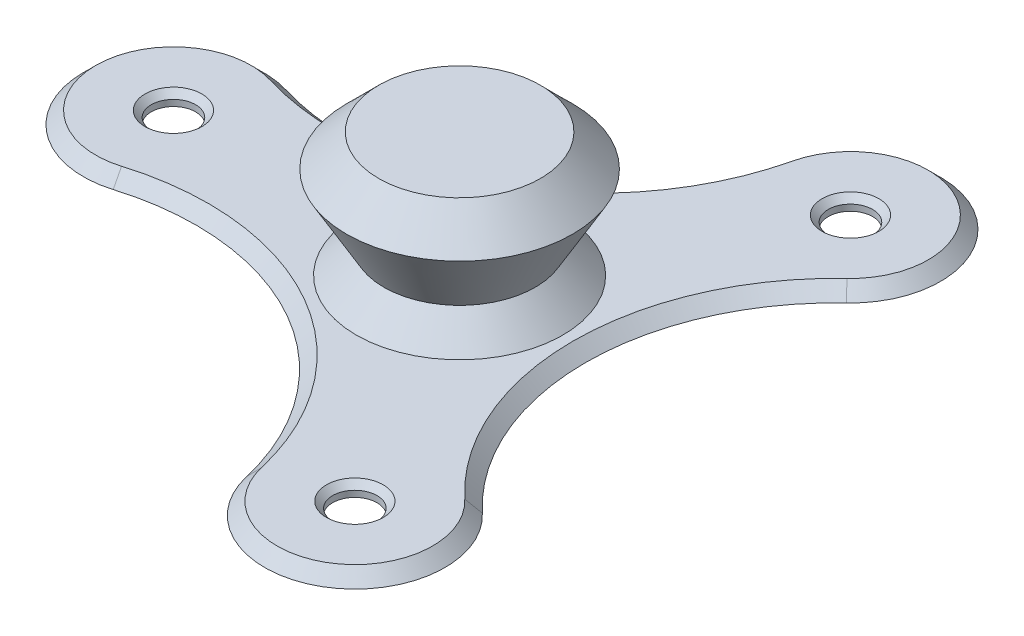
ISO-10303-21;
HEADER;
FILE_DESCRIPTION(('STEP AP214'),'2;1');
FILE_NAME('part.step','',(''),(''),'','','');
FILE_SCHEMA(('AUTOMOTIVE_DESIGN { 1 0 10303 214 1 1 1 1 }'));
ENDSEC;
DATA;
#1=APPLICATION_CONTEXT('core data for automotive mechanical design processes');
#2=APPLICATION_PROTOCOL_DEFINITION('international standard','automotive_design',2000,#1);
#3=PRODUCT_CONTEXT('',#1,'mechanical');
#4=PRODUCT('Part','Part','',(#3));
#5=PRODUCT_RELATED_PRODUCT_CATEGORY('part','',(#4));
#6=PRODUCT_DEFINITION_FORMATION('','',#4);
#7=PRODUCT_DEFINITION_CONTEXT('part definition',#1,'design');
#8=PRODUCT_DEFINITION('design','',#6,#7);
#9=PRODUCT_DEFINITION_SHAPE('','',#8);
#10=(LENGTH_UNIT() NAMED_UNIT(*) SI_UNIT(.MILLI.,.METRE.));
#11=(NAMED_UNIT(*) PLANE_ANGLE_UNIT() SI_UNIT($,.RADIAN.));
#12=(NAMED_UNIT(*) SI_UNIT($,.STERADIAN.) SOLID_ANGLE_UNIT());
#13=UNCERTAINTY_MEASURE_WITH_UNIT(LENGTH_MEASURE(1.E-05),#10,'distance_accuracy_value','');
#14=(GEOMETRIC_REPRESENTATION_CONTEXT(3) GLOBAL_UNCERTAINTY_ASSIGNED_CONTEXT((#13)) GLOBAL_UNIT_ASSIGNED_CONTEXT((#10,
#11,#12)) REPRESENTATION_CONTEXT('',''));
#15=CARTESIAN_POINT('',(0.,0.,0.));
#16=DIRECTION('',(0.,0.,1.));
#17=DIRECTION('',(1.,0.,0.));
#18=AXIS2_PLACEMENT_3D('',#15,#16,#17);
#19=CARTESIAN_POINT('',(-3.59374999999994,2.,-46.0617261637851));
#20=DIRECTION('',(0.,1.,0.));
#21=DIRECTION('',(0.,0.,1.));
#22=AXIS2_PLACEMENT_3D('',#19,#20,#21);
#23=PLANE('',#22);
#24=CARTESIAN_POINT('',(22.9999999999996,2.,39.8371685740844));
#25=DIRECTION('',(0.,1.,0.));
#26=DIRECTION('',(0.,0.,1.));
#27=AXIS2_PLACEMENT_3D('',#24,#25,#26);
#28=CIRCLE('',#27,4.56250000000001);
#29=CARTESIAN_POINT('',(22.9999999999996,2.,44.3996685740844));
#30=VERTEX_POINT('',#29);
#31=EDGE_CURVE('E180',#30,#30,#28,.F.);
#32=ORIENTED_EDGE('',*,*,#31,.T.);
#33=EDGE_LOOP('',(#32));
#34=FACE_BOUND('',#33,.T.);
#35=CARTESIAN_POINT('',(23.0000000000002,2.,-39.8371685740843));
#36=DIRECTION('',(0.,1.,0.));
#37=DIRECTION('',(0.,0.,1.));
#38=AXIS2_PLACEMENT_3D('',#35,#36,#37);
#39=CIRCLE('',#38,4.56250000000001);
#40=CARTESIAN_POINT('',(23.0000000000002,2.,-35.2746685740843));
#41=VERTEX_POINT('',#40);
#42=EDGE_CURVE('E177',#41,#41,#39,.F.);
#43=ORIENTED_EDGE('',*,*,#42,.T.);
#44=EDGE_LOOP('',(#43));
#45=FACE_BOUND('',#44,.T.);
#46=CARTESIAN_POINT('',(-46.,2.,0.));
#47=DIRECTION('',(0.,1.,0.));
#48=DIRECTION('',(0.,0.,1.));
#49=AXIS2_PLACEMENT_3D('',#46,#47,#48);
#50=CIRCLE('',#49,4.56250000000001);
#51=CARTESIAN_POINT('',(-46.,2.,4.56250000000001));
#52=VERTEX_POINT('',#51);
#53=EDGE_CURVE('E174',#52,#52,#50,.F.);
#54=ORIENTED_EDGE('',*,*,#53,.T.);
#55=EDGE_LOOP('',(#54));
#56=FACE_BOUND('',#55,.T.);
#57=CARTESIAN_POINT('',(22.9999999999996,2.,39.8371685740844));
#58=DIRECTION('',(0.,1.,0.));
#59=DIRECTION('',(0.,0.,1.));
#60=AXIS2_PLACEMENT_3D('',#57,#58,#59);
#61=CIRCLE('',#60,12.4999999999999);
#62=CARTESIAN_POINT('',(10.828947368421,2.,42.685936349691));
#63=VERTEX_POINT('',#62);
#64=CARTESIAN_POINT('',(31.5526315789471,2.,30.7211116921432));
#65=VERTEX_POINT('',#64);
#66=EDGE_CURVE('E67',#63,#65,#61,.T.);
#67=ORIENTED_EDGE('',*,*,#66,.T.);
#68=CARTESIAN_POINT('',(60.3750000000006,2.,3.03257842181724E-13));
#69=DIRECTION('',(0.,1.,0.));
#70=DIRECTION('',(0.,0.,1.));
#71=AXIS2_PLACEMENT_3D('',#68,#69,#70);
#72=CIRCLE('',#71,42.1250000000006);
#73=CARTESIAN_POINT('',(31.5526315789475,2.,-30.7211116921428));
#74=VERTEX_POINT('',#73);
#75=EDGE_CURVE('E161',#65,#74,#72,.F.);
#76=ORIENTED_EDGE('',*,*,#75,.T.);
#77=CARTESIAN_POINT('',(23.0000000000002,2.,-39.8371685740841));
#78=DIRECTION('',(0.,1.,0.));
#79=DIRECTION('',(0.,0.,1.));
#80=AXIS2_PLACEMENT_3D('',#77,#78,#79);
#81=CIRCLE('',#80,12.4999999999999);
#82=CARTESIAN_POINT('',(10.8289473684214,2.,-42.685936349691));
#83=VERTEX_POINT('',#82);
#84=EDGE_CURVE('E159',#74,#83,#81,.T.);
#85=ORIENTED_EDGE('',*,*,#84,.T.);
#86=CARTESIAN_POINT('',(-30.1875000000001,2.,-52.2862837534862));
#87=DIRECTION('',(0.,1.,0.));
#88=DIRECTION('',(0.,0.,1.));
#89=AXIS2_PLACEMENT_3D('',#86,#87,#88);
#90=CIRCLE('',#89,42.1250000000006);
#91=CARTESIAN_POINT('',(-42.3815789473686,2.,-11.9648246575481));
#92=VERTEX_POINT('',#91);
#93=EDGE_CURVE('E156',#83,#92,#90,.F.);
#94=ORIENTED_EDGE('',*,*,#93,.T.);
#95=CARTESIAN_POINT('',(-46.,2.,0.));
#96=DIRECTION('',(0.,1.,0.));
#97=DIRECTION('',(0.,0.,1.));
#98=AXIS2_PLACEMENT_3D('',#95,#96,#97);
#99=CIRCLE('',#98,12.4999999999999);
#100=CARTESIAN_POINT('',(-42.3815789473686,2.,11.9648246575481));
#101=VERTEX_POINT('',#100);
#102=EDGE_CURVE('E116',#92,#101,#99,.T.);
#103=ORIENTED_EDGE('',*,*,#102,.T.);
#104=CARTESIAN_POINT('',(-30.1875000000006,2.,52.2862837534859));
#105=DIRECTION('',(0.,1.,0.));
#106=DIRECTION('',(0.,0.,1.));
#107=AXIS2_PLACEMENT_3D('',#104,#105,#106);
#108=CIRCLE('',#107,42.1250000000006);
#109=EDGE_CURVE('E154',#101,#63,#108,.F.);
#110=ORIENTED_EDGE('',*,*,#109,.T.);
#111=EDGE_LOOP('',(#67,#76,#85,#94,#103,#110));
#112=FACE_BOUND('',#111,.T.);
#113=CARTESIAN_POINT('',(0.,2.,2.40979217155909E-13));
#114=DIRECTION('',(0.,1.,0.));
#115=DIRECTION('',(0.,0.,1.));
#116=AXIS2_PLACEMENT_3D('',#113,#114,#115);
#117=CIRCLE('',#116,16.6076951545868);
#118=CARTESIAN_POINT('',(0.,2.,16.607695154587));
#119=VERTEX_POINT('',#118);
#120=EDGE_CURVE('E150',#119,#119,#117,.F.);
#121=ORIENTED_EDGE('',*,*,#120,.T.);
#122=EDGE_LOOP('',(#121));
#123=FACE_BOUND('',#122,.T.);
#124=ADVANCED_FACE('F43',(#34,#45,#56,#112,#123),#23,.T.);
#125=CARTESIAN_POINT('',(-3.59374999999994,0.,-46.0617261637851));
#126=DIRECTION('',(0.,1.,0.));
#127=DIRECTION('',(0.,0.,1.));
#128=AXIS2_PLACEMENT_3D('',#125,#126,#127);
#129=PLANE('',#128);
#130=CARTESIAN_POINT('',(0.,0.,2.75522708131236E-13));
#131=DIRECTION('',(0.,1.,0.));
#132=DIRECTION('',(0.,0.,1.));
#133=AXIS2_PLACEMENT_3D('',#130,#131,#132);
#134=CIRCLE('',#133,15.7792680298406);
#135=CARTESIAN_POINT('',(0.,0.,15.7792680298409));
#136=VERTEX_POINT('',#135);
#137=EDGE_CURVE('E318',#136,#136,#134,.F.);
#138=ORIENTED_EDGE('',*,*,#137,.F.);
#139=EDGE_LOOP('',(#138));
#140=FACE_BOUND('',#139,.T.);
#141=CARTESIAN_POINT('',(-30.1875000000001,0.,-52.2862837534862));
#142=DIRECTION('',(0.,-1.,0.));
#143=DIRECTION('',(0.,0.,1.));
#144=AXIS2_PLACEMENT_3D('',#141,#142,#143);
#145=CIRCLE('',#144,40.1250000000006);
#146=CARTESIAN_POINT('',(8.88157894736882,0.,-43.1417391937881));
#147=VERTEX_POINT('',#146);
#148=CARTESIAN_POINT('',(-41.8026315789476,0.,-13.8791966027558));
#149=VERTEX_POINT('',#148);
#150=EDGE_CURVE('E104',#147,#149,#145,.T.);
#151=ORIENTED_EDGE('',*,*,#150,.F.);
#152=CARTESIAN_POINT('',(23.0000000000002,0.,-39.8371685740841));
#153=DIRECTION('',(0.,1.,0.));
#154=DIRECTION('',(0.,0.,1.));
#155=AXIS2_PLACEMENT_3D('',#152,#153,#154);
#156=CIRCLE('',#155,14.4999999999998);
#157=CARTESIAN_POINT('',(32.9210526315791,0.,-29.2625425910322));
#158=VERTEX_POINT('',#157);
#159=EDGE_CURVE('E139',#158,#147,#156,.T.);
#160=ORIENTED_EDGE('',*,*,#159,.F.);
#161=CARTESIAN_POINT('',(60.3750000000006,0.,3.03257842181724E-13));
#162=DIRECTION('',(0.,-1.,0.));
#163=DIRECTION('',(0.,0.,1.));
#164=AXIS2_PLACEMENT_3D('',#161,#162,#163);
#165=CIRCLE('',#164,40.1250000000006);
#166=CARTESIAN_POINT('',(32.9210526315787,0.,29.2625425910326));
#167=VERTEX_POINT('',#166);
#168=EDGE_CURVE('E137',#167,#158,#165,.T.);
#169=ORIENTED_EDGE('',*,*,#168,.F.);
#170=CARTESIAN_POINT('',(22.9999999999996,0.,39.8371685740844));
#171=DIRECTION('',(0.,1.,0.));
#172=DIRECTION('',(0.,0.,1.));
#173=AXIS2_PLACEMENT_3D('',#170,#171,#172);
#174=CIRCLE('',#173,14.4999999999998);
#175=CARTESIAN_POINT('',(8.88157894736839,0.,43.1417391937881));
#176=VERTEX_POINT('',#175);
#177=EDGE_CURVE('E134',#176,#167,#174,.T.);
#178=ORIENTED_EDGE('',*,*,#177,.F.);
#179=CARTESIAN_POINT('',(-30.1875000000006,0.,52.2862837534859));
#180=DIRECTION('',(0.,-1.,0.));
#181=DIRECTION('',(0.,0.,1.));
#182=AXIS2_PLACEMENT_3D('',#179,#180,#181);
#183=CIRCLE('',#182,40.1250000000006);
#184=CARTESIAN_POINT('',(-41.8026315789476,0.,13.8791966027558));
#185=VERTEX_POINT('',#184);
#186=EDGE_CURVE('E107',#185,#176,#183,.T.);
#187=ORIENTED_EDGE('',*,*,#186,.F.);
#188=CARTESIAN_POINT('',(-46.,0.,0.));
#189=DIRECTION('',(0.,1.,0.));
#190=DIRECTION('',(0.,0.,1.));
#191=AXIS2_PLACEMENT_3D('',#188,#189,#190);
#192=CIRCLE('',#191,14.4999999999998);
#193=EDGE_CURVE('E99',#149,#185,#192,.T.);
#194=ORIENTED_EDGE('',*,*,#193,.F.);
#195=EDGE_LOOP('',(#151,#160,#169,#178,#187,#194));
#196=FACE_BOUND('',#195,.T.);
#197=CARTESIAN_POINT('',(-46.,0.,0.));
#198=DIRECTION('',(0.,1.,0.));
#199=DIRECTION('',(0.,0.,1.));
#200=AXIS2_PLACEMENT_3D('',#197,#198,#199);
#201=CIRCLE('',#200,3.5625);
#202=CARTESIAN_POINT('',(-46.,0.,3.5625));
#203=VERTEX_POINT('',#202);
#204=EDGE_CURVE('E126',#203,#203,#201,.T.);
#205=ORIENTED_EDGE('',*,*,#204,.T.);
#206=EDGE_LOOP('',(#205));
#207=FACE_BOUND('',#206,.T.);
#208=CARTESIAN_POINT('',(23.0000000000002,0.,-39.8371685740843));
#209=DIRECTION('',(0.,1.,0.));
#210=DIRECTION('',(0.,0.,1.));
#211=AXIS2_PLACEMENT_3D('',#208,#209,#210);
#212=CIRCLE('',#211,3.5625);
#213=CARTESIAN_POINT('',(23.0000000000002,0.,-36.2746685740843));
#214=VERTEX_POINT('',#213);
#215=EDGE_CURVE('E129',#214,#214,#212,.T.);
#216=ORIENTED_EDGE('',*,*,#215,.T.);
#217=EDGE_LOOP('',(#216));
#218=FACE_BOUND('',#217,.T.);
#219=CARTESIAN_POINT('',(22.9999999999996,0.,39.8371685740844));
#220=DIRECTION('',(0.,1.,0.));
#221=DIRECTION('',(0.,0.,1.));
#222=AXIS2_PLACEMENT_3D('',#219,#220,#221);
#223=CIRCLE('',#222,3.5625);
#224=CARTESIAN_POINT('',(22.9999999999996,0.,43.3996685740844));
#225=VERTEX_POINT('',#224);
#226=EDGE_CURVE('E316',#225,#225,#223,.T.);
#227=ORIENTED_EDGE('',*,*,#226,.T.);
#228=EDGE_LOOP('',(#227));
#229=FACE_BOUND('',#228,.T.);
#230=ADVANCED_FACE('F101',(#140,#196,#207,#218,#229),#129,.F.);
#231=CARTESIAN_POINT('',(-46.,2.,0.));
#232=DIRECTION('',(0.,-1.,0.));
#233=DIRECTION('',(0.,0.,-1.));
#234=AXIS2_PLACEMENT_3D('',#231,#232,#233);
#235=CYLINDRICAL_SURFACE('',#234,3.5625);
#236=CARTESIAN_POINT('',(-46.,0.999999999999994,0.));
#237=DIRECTION('',(0.,1.,0.));
#238=DIRECTION('',(0.,0.,1.));
#239=AXIS2_PLACEMENT_3D('',#236,#237,#238);
#240=CIRCLE('',#239,3.5625);
#241=CARTESIAN_POINT('',(-46.,0.999999999999994,3.5625));
#242=VERTEX_POINT('',#241);
#243=EDGE_CURVE('E11',#242,#242,#240,.T.);
#244=ORIENTED_EDGE('',*,*,#243,.T.);
#245=EDGE_LOOP('',(#244));
#246=FACE_BOUND('',#245,.T.);
#247=ORIENTED_EDGE('',*,*,#204,.F.);
#248=EDGE_LOOP('',(#247));
#249=FACE_BOUND('',#248,.T.);
#250=ADVANCED_FACE('F210',(#246,#249),#235,.F.);
#251=CARTESIAN_POINT('',(23.0000000000002,2.,-39.8371685740843));
#252=DIRECTION('',(0.,-1.,0.));
#253=DIRECTION('',(0.,0.,-1.));
#254=AXIS2_PLACEMENT_3D('',#251,#252,#253);
#255=CYLINDRICAL_SURFACE('',#254,3.5625);
#256=CARTESIAN_POINT('',(23.0000000000002,0.999999999999992,-39.8371685740843));
#257=DIRECTION('',(0.,1.,0.));
#258=DIRECTION('',(0.,0.,1.));
#259=AXIS2_PLACEMENT_3D('',#256,#257,#258);
#260=CIRCLE('',#259,3.5625);
#261=CARTESIAN_POINT('',(23.0000000000002,0.999999999999992,-36.2746685740843));
#262=VERTEX_POINT('',#261);
#263=EDGE_CURVE('E52',#262,#262,#260,.T.);
#264=ORIENTED_EDGE('',*,*,#263,.T.);
#265=EDGE_LOOP('',(#264));
#266=FACE_BOUND('',#265,.T.);
#267=ORIENTED_EDGE('',*,*,#215,.F.);
#268=EDGE_LOOP('',(#267));
#269=FACE_BOUND('',#268,.T.);
#270=ADVANCED_FACE('F185',(#266,#269),#255,.F.);
#271=CARTESIAN_POINT('',(22.9999999999996,2.,39.8371685740844));
#272=DIRECTION('',(0.,-1.,0.));
#273=DIRECTION('',(0.,0.,-1.));
#274=AXIS2_PLACEMENT_3D('',#271,#272,#273);
#275=CYLINDRICAL_SURFACE('',#274,3.5625);
#276=CARTESIAN_POINT('',(22.9999999999996,0.999999999999992,39.8371685740844));
#277=DIRECTION('',(0.,1.,0.));
#278=DIRECTION('',(0.,0.,1.));
#279=AXIS2_PLACEMENT_3D('',#276,#277,#278);
#280=CIRCLE('',#279,3.5625);
#281=CARTESIAN_POINT('',(22.9999999999996,0.999999999999992,43.3996685740844));
#282=VERTEX_POINT('',#281);
#283=EDGE_CURVE('E163',#282,#282,#280,.T.);
#284=ORIENTED_EDGE('',*,*,#283,.T.);
#285=EDGE_LOOP('',(#284));
#286=FACE_BOUND('',#285,.T.);
#287=ORIENTED_EDGE('',*,*,#226,.F.);
#288=EDGE_LOOP('',(#287));
#289=FACE_BOUND('',#288,.T.);
#290=ADVANCED_FACE('F297',(#286,#289),#275,.F.);
#291=CARTESIAN_POINT('',(0.,0.,2.0122792321331E-13));
#292=DIRECTION('',(0.,1.,0.));
#293=DIRECTION('',(0.,0.,1.));
#294=AXIS2_PLACEMENT_3D('',#291,#292,#293);
#295=CONICAL_SURFACE('',#294,8.45299461620755,0.523598775598306);
#296=CARTESIAN_POINT('',(0.,6.43782217350887,2.47413144299533E-13));
#297=DIRECTION('',(0.,1.,0.));
#298=DIRECTION('',(0.,0.,1.));
#299=AXIS2_PLACEMENT_3D('',#296,#297,#298);
#300=CIRCLE('',#299,12.1698729810779);
#301=CARTESIAN_POINT('',(0.,6.43782217350883,12.1698729810782));
#302=VERTEX_POINT('',#301);
#303=EDGE_CURVE('E147',#302,#302,#300,.T.);
#304=ORIENTED_EDGE('',*,*,#303,.T.);
#305=EDGE_LOOP('',(#304));
#306=FACE_BOUND('',#305,.T.);
#307=CARTESIAN_POINT('',(0.,16.8301270189222,2.58959449571088E-13));
#308=DIRECTION('',(0.,-1.,0.));
#309=DIRECTION('',(0.,0.,-1.));
#310=AXIS2_PLACEMENT_3D('',#307,#308,#309);
#311=CIRCLE('',#310,18.169872981078);
#312=CARTESIAN_POINT('',(0.,16.8301270189222,-18.1698729810778));
#313=VERTEX_POINT('',#312);
#314=EDGE_CURVE('E141',#313,#313,#311,.T.);
#315=ORIENTED_EDGE('',*,*,#314,.T.);
#316=EDGE_LOOP('',(#315));
#317=FACE_BOUND('',#316,.T.);
#318=ADVANCED_FACE('F293',(#306,#317),#295,.T.);
#319=CARTESIAN_POINT('',(0.,22.,-20.));
#320=DIRECTION('',(0.,1.,0.));
#321=DIRECTION('',(0.,0.,1.));
#322=AXIS2_PLACEMENT_3D('',#319,#320,#321);
#323=PLANE('',#322);
#324=CARTESIAN_POINT('',(0.,22.,2.76693401188797E-13));
#325=DIRECTION('',(0.,1.,0.));
#326=DIRECTION('',(0.,0.,1.));
#327=AXIS2_PLACEMENT_3D('',#324,#325,#326);
#328=CIRCLE('',#327,13.0000000000003);
#329=CARTESIAN_POINT('',(0.,21.9999999999999,13.0000000000006));
#330=VERTEX_POINT('',#329);
#331=EDGE_CURVE('E144',#330,#330,#328,.T.);
#332=ORIENTED_EDGE('',*,*,#331,.T.);
#333=EDGE_LOOP('',(#332));
#334=FACE_BOUND('',#333,.T.);
#335=ADVANCED_FACE('F225',(#334),#323,.T.);
#336=CARTESIAN_POINT('',(0.,14.9999999999999,2.52681658196596E-13));
#337=DIRECTION('',(0.,-1.,0.));
#338=DIRECTION('',(0.,0.,-1.));
#339=AXIS2_PLACEMENT_3D('',#336,#337,#338);
#340=CONICAL_SURFACE('',#339,20.0000000000003,0.785398163397442);
#341=ORIENTED_EDGE('',*,*,#331,.F.);
#342=EDGE_LOOP('',(#341));
#343=FACE_BOUND('',#342,.T.);
#344=ORIENTED_EDGE('',*,*,#314,.F.);
#345=EDGE_LOOP('',(#344));
#346=FACE_BOUND('',#345,.T.);
#347=ADVANCED_FACE('F218',(#343,#346),#340,.T.);
#348=CARTESIAN_POINT('',(0.,6.43782217350887,2.47413144299533E-13));
#349=DIRECTION('',(0.,-1.,0.));
#350=DIRECTION('',(0.,0.,-1.));
#351=AXIS2_PLACEMENT_3D('',#348,#349,#350);
#352=CONICAL_SURFACE('',#351,12.1698729810779,0.78539816339745);
#353=ORIENTED_EDGE('',*,*,#120,.F.);
#354=EDGE_LOOP('',(#353));
#355=FACE_BOUND('',#354,.T.);
#356=ORIENTED_EDGE('',*,*,#303,.F.);
#357=EDGE_LOOP('',(#356));
#358=FACE_BOUND('',#357,.T.);
#359=ADVANCED_FACE('F224',(#355,#358),#352,.T.);
#360=CARTESIAN_POINT('',(0.,1.00000000000001,2.04658172212196E-13));
#361=DIRECTION('',(0.,1.,0.));
#362=DIRECTION('',(0.,0.,1.));
#363=AXIS2_PLACEMENT_3D('',#360,#361,#362);
#364=CONICAL_SURFACE('',#363,6.72094380863868,0.523598775598306);
#365=CARTESIAN_POINT('',(0.,6.10877284431053,2.22182535146927E-13));
#366=DIRECTION('',(0.,-1.,0.));
#367=DIRECTION('',(0.,0.,-1.));
#368=AXIS2_PLACEMENT_3D('',#365,#366,#367);
#369=CIRCLE('',#368,9.67049518553006);
#370=CARTESIAN_POINT('',(0.,6.10877284431054,-9.67049518552984));
#371=VERTEX_POINT('',#370);
#372=EDGE_CURVE('E320',#371,#371,#369,.F.);
#373=ORIENTED_EDGE('',*,*,#372,.F.);
#374=EDGE_LOOP('',(#373));
#375=FACE_BOUND('',#374,.T.);
#376=CARTESIAN_POINT('',(0.,16.5010776897238,2.57830728439021E-13));
#377=DIRECTION('',(0.,-1.,0.));
#378=DIRECTION('',(0.,0.,-1.));
#379=AXIS2_PLACEMENT_3D('',#376,#377,#378);
#380=CIRCLE('',#379,15.6704951855302);
#381=CARTESIAN_POINT('',(0.,16.5010776897239,-15.6704951855299));
#382=VERTEX_POINT('',#381);
#383=EDGE_CURVE('E171',#382,#382,#380,.T.);
#384=ORIENTED_EDGE('',*,*,#383,.F.);
#385=EDGE_LOOP('',(#384));
#386=FACE_BOUND('',#385,.T.);
#387=ADVANCED_FACE('F232',(#375,#386),#364,.F.);
#388=CARTESIAN_POINT('',(0.,20.,-20.));
#389=DIRECTION('',(0.,1.,0.));
#390=DIRECTION('',(0.,0.,1.));
#391=AXIS2_PLACEMENT_3D('',#388,#389,#390);
#392=PLANE('',#391);
#393=CARTESIAN_POINT('',(0.,20.,2.69832903191026E-13));
#394=DIRECTION('',(0.,1.,0.));
#395=DIRECTION('',(0.,0.,1.));
#396=AXIS2_PLACEMENT_3D('',#393,#394,#395);
#397=CIRCLE('',#396,12.1715728752541);
#398=CARTESIAN_POINT('',(0.,19.9999999999999,12.1715728752544));
#399=VERTEX_POINT('',#398);
#400=EDGE_CURVE('E323',#399,#399,#397,.T.);
#401=ORIENTED_EDGE('',*,*,#400,.F.);
#402=EDGE_LOOP('',(#401));
#403=FACE_BOUND('',#402,.T.);
#404=ADVANCED_FACE('F284',(#403),#392,.F.);
#405=CARTESIAN_POINT('',(0.,13.5857864376268,2.47830553540055E-13));
#406=DIRECTION('',(0.,-1.,0.));
#407=DIRECTION('',(0.,0.,-1.));
#408=AXIS2_PLACEMENT_3D('',#405,#406,#407);
#409=CONICAL_SURFACE('',#408,18.5857864376272,0.785398163397442);
#410=ORIENTED_EDGE('',*,*,#400,.T.);
#411=EDGE_LOOP('',(#410));
#412=FACE_BOUND('',#411,.T.);
#413=ORIENTED_EDGE('',*,*,#383,.T.);
#414=EDGE_LOOP('',(#413));
#415=FACE_BOUND('',#414,.T.);
#416=ADVANCED_FACE('F278',(#412,#415),#409,.F.);
#417=CARTESIAN_POINT('',(0.,5.02360861113578,2.45362826222313E-13));
#418=DIRECTION('',(0.,-1.,0.));
#419=DIRECTION('',(0.,0.,-1.));
#420=AXIS2_PLACEMENT_3D('',#417,#418,#419);
#421=CONICAL_SURFACE('',#420,10.7556594187048,0.78539816339745);
#422=ORIENTED_EDGE('',*,*,#137,.T.);
#423=EDGE_LOOP('',(#422));
#424=FACE_BOUND('',#423,.T.);
#425=ORIENTED_EDGE('',*,*,#372,.T.);
#426=EDGE_LOOP('',(#425));
#427=FACE_BOUND('',#426,.T.);
#428=ADVANCED_FACE('F268',(#424,#427),#421,.F.);
#429=CARTESIAN_POINT('',(-46.,2.,0.));
#430=DIRECTION('',(0.,-1.,0.));
#431=DIRECTION('',(0.,0.,-1.));
#432=AXIS2_PLACEMENT_3D('',#429,#430,#431);
#433=CONICAL_SURFACE('',#432,12.4999999999999,0.78539816339745);
#434=DIRECTION('',(-0.204688805080315,0.707106781186546,0.676832692084827));
#435=VECTOR('',#434,1.);
#436=CARTESIAN_POINT('',(-41.8026315789476,0.,-13.8791966027558));
#437=LINE('',#436,#435);
#438=EDGE_CURVE('E114',#149,#92,#437,.T.);
#439=ORIENTED_EDGE('',*,*,#438,.F.);
#440=ORIENTED_EDGE('',*,*,#193,.T.);
#441=DIRECTION('',(0.204688805080308,-0.707106781186546,0.67683269208483));
#442=VECTOR('',#441,1.);
#443=CARTESIAN_POINT('',(-42.3815789473686,2.,11.9648246575481));
#444=LINE('',#443,#442);
#445=EDGE_CURVE('E119',#101,#185,#444,.T.);
#446=ORIENTED_EDGE('',*,*,#445,.F.);
#447=ORIENTED_EDGE('',*,*,#102,.F.);
#448=EDGE_LOOP('',(#439,#440,#446,#447));
#449=FACE_BOUND('',#448,.T.);
#450=ADVANCED_FACE('F115',(#449),#433,.T.);
#451=CARTESIAN_POINT('',(-30.1875000000006,2.,52.2862837534859));
#452=DIRECTION('',(0.,1.,0.));
#453=DIRECTION('',(0.,0.,1.));
#454=AXIS2_PLACEMENT_3D('',#451,#452,#453);
#455=CONICAL_SURFACE('',#454,42.1250000000006,0.785398163397449);
#456=ORIENTED_EDGE('',*,*,#445,.T.);
#457=ORIENTED_EDGE('',*,*,#186,.T.);
#458=DIRECTION('',(-0.688498707997428,-0.707106781186546,0.161150640972581));
#459=VECTOR('',#458,1.);
#460=CARTESIAN_POINT('',(10.828947368421,2.,42.685936349691));
#461=LINE('',#460,#459);
#462=EDGE_CURVE('E120',#63,#176,#461,.T.);
#463=ORIENTED_EDGE('',*,*,#462,.F.);
#464=ORIENTED_EDGE('',*,*,#109,.F.);
#465=EDGE_LOOP('',(#456,#457,#463,#464));
#466=FACE_BOUND('',#465,.T.);
#467=ADVANCED_FACE('F259',(#466),#455,.F.);
#468=CARTESIAN_POINT('',(-30.1875000000001,2.,-52.2862837534862));
#469=DIRECTION('',(0.,1.,0.));
#470=DIRECTION('',(0.,0.,1.));
#471=AXIS2_PLACEMENT_3D('',#468,#469,#470);
#472=CONICAL_SURFACE('',#471,42.1250000000006,0.785398163397452);
#473=ORIENTED_EDGE('',*,*,#438,.T.);
#474=ORIENTED_EDGE('',*,*,#93,.F.);
#475=DIRECTION('',(0.688498707997427,0.707106781186546,0.161150640972588));
#476=VECTOR('',#475,1.);
#477=CARTESIAN_POINT('',(8.88157894736885,0.,-43.1417391937881));
#478=LINE('',#477,#476);
#479=EDGE_CURVE('E124',#147,#83,#478,.T.);
#480=ORIENTED_EDGE('',*,*,#479,.F.);
#481=ORIENTED_EDGE('',*,*,#150,.T.);
#482=EDGE_LOOP('',(#473,#474,#480,#481));
#483=FACE_BOUND('',#482,.T.);
#484=ADVANCED_FACE('F122',(#483),#472,.F.);
#485=CARTESIAN_POINT('',(22.9999999999996,2.,39.8371685740844));
#486=DIRECTION('',(0.,-1.,0.));
#487=DIRECTION('',(0.,0.,-1.));
#488=AXIS2_PLACEMENT_3D('',#485,#486,#487);
#489=CONICAL_SURFACE('',#488,12.4999999999999,0.785398163397451);
#490=ORIENTED_EDGE('',*,*,#462,.T.);
#491=ORIENTED_EDGE('',*,*,#177,.T.);
#492=DIRECTION('',(0.483809902917119,-0.707106781186546,-0.515682051112243));
#493=VECTOR('',#492,1.);
#494=CARTESIAN_POINT('',(31.5526315789471,2.,30.7211116921432));
#495=LINE('',#494,#493);
#496=EDGE_CURVE('E165',#65,#167,#495,.T.);
#497=ORIENTED_EDGE('',*,*,#496,.F.);
#498=ORIENTED_EDGE('',*,*,#66,.F.);
#499=EDGE_LOOP('',(#490,#491,#497,#498));
#500=FACE_BOUND('',#499,.T.);
#501=ADVANCED_FACE('F246',(#500),#489,.T.);
#502=CARTESIAN_POINT('',(23.0000000000002,2.,-39.8371685740841));
#503=DIRECTION('',(0.,-1.,0.));
#504=DIRECTION('',(0.,0.,-1.));
#505=AXIS2_PLACEMENT_3D('',#502,#503,#504);
#506=CONICAL_SURFACE('',#505,12.4999999999999,0.78539816339745);
#507=ORIENTED_EDGE('',*,*,#479,.T.);
#508=ORIENTED_EDGE('',*,*,#84,.F.);
#509=DIRECTION('',(-0.483809902917115,0.707106781186546,-0.515682051112246));
#510=VECTOR('',#509,1.);
#511=CARTESIAN_POINT('',(32.9210526315791,0.,-29.2625425910322));
#512=LINE('',#511,#510);
#513=EDGE_CURVE('E59',#158,#74,#512,.T.);
#514=ORIENTED_EDGE('',*,*,#513,.F.);
#515=ORIENTED_EDGE('',*,*,#159,.T.);
#516=EDGE_LOOP('',(#507,#508,#514,#515));
#517=FACE_BOUND('',#516,.T.);
#518=ADVANCED_FACE('F240',(#517),#506,.T.);
#519=CARTESIAN_POINT('',(60.3750000000006,2.,3.03257842181724E-13));
#520=DIRECTION('',(0.,1.,0.));
#521=DIRECTION('',(0.,0.,1.));
#522=AXIS2_PLACEMENT_3D('',#519,#520,#521);
#523=CONICAL_SURFACE('',#522,42.1250000000006,0.785398163397452);
#524=ORIENTED_EDGE('',*,*,#496,.T.);
#525=ORIENTED_EDGE('',*,*,#168,.T.);
#526=ORIENTED_EDGE('',*,*,#513,.T.);
#527=ORIENTED_EDGE('',*,*,#75,.F.);
#528=EDGE_LOOP('',(#524,#525,#526,#527));
#529=FACE_BOUND('',#528,.T.);
#530=ADVANCED_FACE('F197',(#529),#523,.F.);
#531=CARTESIAN_POINT('',(22.9999999999996,0.999999999999992,39.8371685740844));
#532=DIRECTION('',(0.,1.,0.));
#533=DIRECTION('',(0.,0.,1.));
#534=AXIS2_PLACEMENT_3D('',#531,#532,#533);
#535=CONICAL_SURFACE('',#534,3.5625,0.785398163397449);
#536=ORIENTED_EDGE('',*,*,#31,.F.);
#537=EDGE_LOOP('',(#536));
#538=FACE_BOUND('',#537,.T.);
#539=ORIENTED_EDGE('',*,*,#283,.F.);
#540=EDGE_LOOP('',(#539));
#541=FACE_BOUND('',#540,.T.);
#542=ADVANCED_FACE('F190',(#538,#541),#535,.F.);
#543=CARTESIAN_POINT('',(23.0000000000002,0.999999999999992,-39.8371685740843));
#544=DIRECTION('',(0.,1.,0.));
#545=DIRECTION('',(0.,0.,1.));
#546=AXIS2_PLACEMENT_3D('',#543,#544,#545);
#547=CONICAL_SURFACE('',#546,3.5625,0.785398163397449);
#548=ORIENTED_EDGE('',*,*,#42,.F.);
#549=EDGE_LOOP('',(#548));
#550=FACE_BOUND('',#549,.T.);
#551=ORIENTED_EDGE('',*,*,#263,.F.);
#552=EDGE_LOOP('',(#551));
#553=FACE_BOUND('',#552,.T.);
#554=ADVANCED_FACE('F188',(#550,#553),#547,.F.);
#555=CARTESIAN_POINT('',(-46.,0.999999999999994,0.));
#556=DIRECTION('',(0.,1.,0.));
#557=DIRECTION('',(0.,0.,1.));
#558=AXIS2_PLACEMENT_3D('',#555,#556,#557);
#559=CONICAL_SURFACE('',#558,3.5625,0.785398163397449);
#560=ORIENTED_EDGE('',*,*,#53,.F.);
#561=EDGE_LOOP('',(#560));
#562=FACE_BOUND('',#561,.T.);
#563=ORIENTED_EDGE('',*,*,#243,.F.);
#564=EDGE_LOOP('',(#563));
#565=FACE_BOUND('',#564,.T.);
#566=ADVANCED_FACE('F46',(#562,#565),#559,.F.);
#567=CLOSED_SHELL('',(#124,#230,#250,#270,#290,#318,#335,#347,#359,#387,#404,#416,#428,#450,
#467,#484,#501,#518,#530,#542,#554,#566));
#568=MANIFOLD_SOLID_BREP('B2',#567);
#569=ADVANCED_BREP_SHAPE_REPRESENTATION('',(#18,#568),#14);
#570=SHAPE_DEFINITION_REPRESENTATION(#9,#569);
ENDSEC;
END-ISO-10303-21;
